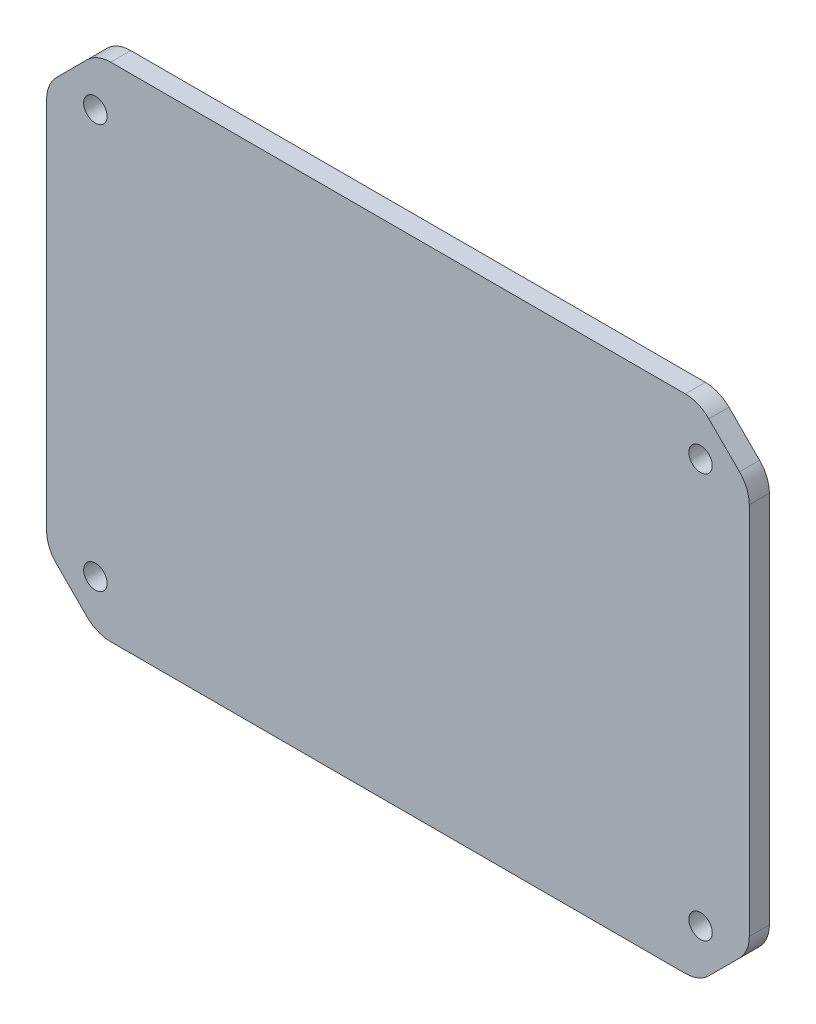
ISO-10303-21;
HEADER;
FILE_DESCRIPTION(('STEP AP214'),'2;1');
FILE_NAME('part.step','',(''),(''),'','','');
FILE_SCHEMA(('AUTOMOTIVE_DESIGN { 1 0 10303 214 1 1 1 1 }'));
ENDSEC;
DATA;
#1=APPLICATION_CONTEXT('core data for automotive mechanical design processes');
#2=APPLICATION_PROTOCOL_DEFINITION('international standard','automotive_design',2000,#1);
#3=PRODUCT_CONTEXT('',#1,'mechanical');
#4=PRODUCT('Part','Part','',(#3));
#5=PRODUCT_RELATED_PRODUCT_CATEGORY('part','',(#4));
#6=PRODUCT_DEFINITION_FORMATION('','',#4);
#7=PRODUCT_DEFINITION_CONTEXT('part definition',#1,'design');
#8=PRODUCT_DEFINITION('design','',#6,#7);
#9=PRODUCT_DEFINITION_SHAPE('','',#8);
#10=(LENGTH_UNIT() NAMED_UNIT(*) SI_UNIT(.MILLI.,.METRE.));
#11=(NAMED_UNIT(*) PLANE_ANGLE_UNIT() SI_UNIT($,.RADIAN.));
#12=(NAMED_UNIT(*) SI_UNIT($,.STERADIAN.) SOLID_ANGLE_UNIT());
#13=UNCERTAINTY_MEASURE_WITH_UNIT(LENGTH_MEASURE(1.E-05),#10,'distance_accuracy_value','');
#14=(GEOMETRIC_REPRESENTATION_CONTEXT(3) GLOBAL_UNCERTAINTY_ASSIGNED_CONTEXT((#13)) GLOBAL_UNIT_ASSIGNED_CONTEXT((#10,
#11,#12)) REPRESENTATION_CONTEXT('',''));
#15=CARTESIAN_POINT('',(0.,0.,0.));
#16=DIRECTION('',(0.,0.,1.));
#17=DIRECTION('',(1.,0.,0.));
#18=AXIS2_PLACEMENT_3D('',#15,#16,#17);
#19=CARTESIAN_POINT('',(-42.9289321881345,-32.5,3.));
#20=DIRECTION('',(0.,0.,1.));
#21=DIRECTION('',(1.,0.,0.));
#22=AXIS2_PLACEMENT_3D('',#19,#20,#21);
#23=PLANE('',#22);
#24=CARTESIAN_POINT('',(45.2144660940672,-30.2144660940673,3.));
#25=DIRECTION('',(0.,0.,1.));
#26=DIRECTION('',(1.,0.,0.));
#27=AXIS2_PLACEMENT_3D('',#24,#25,#26);
#28=CIRCLE('',#27,1.75);
#29=CARTESIAN_POINT('',(46.9644660940672,-30.2144660940673,3.));
#30=VERTEX_POINT('',#29);
#31=EDGE_CURVE('E345',#30,#30,#28,.T.);
#32=ORIENTED_EDGE('',*,*,#31,.F.);
#33=EDGE_LOOP('',(#32));
#34=FACE_BOUND('',#33,.T.);
#35=CARTESIAN_POINT('',(-45.2144660940673,30.2144660940673,3.));
#36=DIRECTION('',(0.,0.,1.));
#37=DIRECTION('',(1.,0.,0.));
#38=AXIS2_PLACEMENT_3D('',#35,#36,#37);
#39=CIRCLE('',#38,1.75);
#40=CARTESIAN_POINT('',(-43.4644660940673,30.2144660940673,3.));
#41=VERTEX_POINT('',#40);
#42=EDGE_CURVE('E184',#41,#41,#39,.T.);
#43=ORIENTED_EDGE('',*,*,#42,.F.);
#44=EDGE_LOOP('',(#43));
#45=FACE_BOUND('',#44,.T.);
#46=CARTESIAN_POINT('',(-42.9289321881345,-32.5,3.));
#47=DIRECTION('',(0.,0.,1.));
#48=DIRECTION('',(1.,0.,0.));
#49=AXIS2_PLACEMENT_3D('',#46,#47,#48);
#50=CIRCLE('',#49,5.);
#51=CARTESIAN_POINT('',(-46.4644660940673,-36.0355339059327,3.));
#52=VERTEX_POINT('',#51);
#53=CARTESIAN_POINT('',(-42.9289321881345,-37.5,3.));
#54=VERTEX_POINT('',#53);
#55=EDGE_CURVE('E211',#52,#54,#50,.T.);
#56=ORIENTED_EDGE('',*,*,#55,.T.);
#57=DIRECTION('',(1.,0.,0.));
#58=VECTOR('',#57,1.);
#59=CARTESIAN_POINT('',(-42.9289321881345,-37.5,3.));
#60=LINE('',#59,#58);
#61=CARTESIAN_POINT('',(42.9289321881345,-37.5,3.));
#62=VERTEX_POINT('',#61);
#63=EDGE_CURVE('E119',#54,#62,#60,.T.);
#64=ORIENTED_EDGE('',*,*,#63,.T.);
#65=CARTESIAN_POINT('',(42.9289321881345,-32.5,3.));
#66=DIRECTION('',(0.,0.,1.));
#67=DIRECTION('',(-1.,0.,0.));
#68=AXIS2_PLACEMENT_3D('',#65,#66,#67);
#69=CIRCLE('',#68,5.);
#70=CARTESIAN_POINT('',(46.4644660940673,-36.0355339059327,3.));
#71=VERTEX_POINT('',#70);
#72=EDGE_CURVE('E250',#62,#71,#69,.T.);
#73=ORIENTED_EDGE('',*,*,#72,.T.);
#74=DIRECTION('',(0.707106781186548,0.707106781186548,0.));
#75=VECTOR('',#74,1.);
#76=CARTESIAN_POINT('',(46.4644660940673,-36.0355339059327,3.));
#77=LINE('',#76,#75);
#78=CARTESIAN_POINT('',(51.0355339059327,-31.4644660940673,3.));
#79=VERTEX_POINT('',#78);
#80=EDGE_CURVE('E269',#71,#79,#77,.T.);
#81=ORIENTED_EDGE('',*,*,#80,.T.);
#82=CARTESIAN_POINT('',(47.5,-27.9289321881345,3.));
#83=DIRECTION('',(0.,0.,1.));
#84=DIRECTION('',(1.,0.,0.));
#85=AXIS2_PLACEMENT_3D('',#82,#83,#84);
#86=CIRCLE('',#85,5.);
#87=CARTESIAN_POINT('',(52.5,-27.9289321881345,3.));
#88=VERTEX_POINT('',#87);
#89=EDGE_CURVE('E266',#79,#88,#86,.T.);
#90=ORIENTED_EDGE('',*,*,#89,.T.);
#91=DIRECTION('',(0.,1.,0.));
#92=VECTOR('',#91,1.);
#93=CARTESIAN_POINT('',(52.5,27.9289321881345,3.));
#94=LINE('',#93,#92);
#95=CARTESIAN_POINT('',(52.5,27.9289321881345,3.));
#96=VERTEX_POINT('',#95);
#97=EDGE_CURVE('E268',#88,#96,#94,.T.);
#98=ORIENTED_EDGE('',*,*,#97,.T.);
#99=CARTESIAN_POINT('',(47.5,27.9289321881345,3.));
#100=DIRECTION('',(0.,0.,1.));
#101=DIRECTION('',(-1.,0.,0.));
#102=AXIS2_PLACEMENT_3D('',#99,#100,#101);
#103=CIRCLE('',#102,5.);
#104=CARTESIAN_POINT('',(51.0355339059327,31.4644660940673,3.));
#105=VERTEX_POINT('',#104);
#106=EDGE_CURVE('E271',#96,#105,#103,.T.);
#107=ORIENTED_EDGE('',*,*,#106,.T.);
#108=DIRECTION('',(-0.707106781186548,0.707106781186548,0.));
#109=VECTOR('',#108,1.);
#110=CARTESIAN_POINT('',(46.4644660940673,36.0355339059327,3.));
#111=LINE('',#110,#109);
#112=CARTESIAN_POINT('',(46.4644660940673,36.0355339059327,3.));
#113=VERTEX_POINT('',#112);
#114=EDGE_CURVE('E277',#105,#113,#111,.T.);
#115=ORIENTED_EDGE('',*,*,#114,.T.);
#116=CARTESIAN_POINT('',(42.9289321881345,32.5,3.));
#117=DIRECTION('',(0.,0.,1.));
#118=DIRECTION('',(1.,0.,0.));
#119=AXIS2_PLACEMENT_3D('',#116,#117,#118);
#120=CIRCLE('',#119,5.);
#121=CARTESIAN_POINT('',(42.9289321881345,37.5,3.));
#122=VERTEX_POINT('',#121);
#123=EDGE_CURVE('E279',#113,#122,#120,.T.);
#124=ORIENTED_EDGE('',*,*,#123,.T.);
#125=DIRECTION('',(-1.,0.,0.));
#126=VECTOR('',#125,1.);
#127=CARTESIAN_POINT('',(-42.9289321881345,37.5,3.));
#128=LINE('',#127,#126);
#129=CARTESIAN_POINT('',(-42.9289321881345,37.5,3.));
#130=VERTEX_POINT('',#129);
#131=EDGE_CURVE('E281',#122,#130,#128,.T.);
#132=ORIENTED_EDGE('',*,*,#131,.T.);
#133=CARTESIAN_POINT('',(-42.9289321881345,32.5,3.));
#134=DIRECTION('',(0.,0.,1.));
#135=DIRECTION('',(-1.,0.,0.));
#136=AXIS2_PLACEMENT_3D('',#133,#134,#135);
#137=CIRCLE('',#136,5.);
#138=CARTESIAN_POINT('',(-46.4644660940673,36.0355339059327,3.));
#139=VERTEX_POINT('',#138);
#140=EDGE_CURVE('E283',#130,#139,#137,.T.);
#141=ORIENTED_EDGE('',*,*,#140,.T.);
#142=DIRECTION('',(-0.707106781186548,-0.707106781186548,0.));
#143=VECTOR('',#142,1.);
#144=CARTESIAN_POINT('',(-51.0355339059327,31.4644660940673,3.));
#145=LINE('',#144,#143);
#146=CARTESIAN_POINT('',(-51.0355339059327,31.4644660940673,3.));
#147=VERTEX_POINT('',#146);
#148=EDGE_CURVE('E285',#139,#147,#145,.T.);
#149=ORIENTED_EDGE('',*,*,#148,.T.);
#150=CARTESIAN_POINT('',(-47.5,27.9289321881345,3.));
#151=DIRECTION('',(0.,0.,1.));
#152=DIRECTION('',(1.,0.,0.));
#153=AXIS2_PLACEMENT_3D('',#150,#151,#152);
#154=CIRCLE('',#153,5.);
#155=CARTESIAN_POINT('',(-52.5,27.9289321881345,3.));
#156=VERTEX_POINT('',#155);
#157=EDGE_CURVE('E162',#147,#156,#154,.T.);
#158=ORIENTED_EDGE('',*,*,#157,.T.);
#159=DIRECTION('',(0.,-1.,0.));
#160=VECTOR('',#159,1.);
#161=CARTESIAN_POINT('',(-52.5,27.9289321881345,3.));
#162=LINE('',#161,#160);
#163=CARTESIAN_POINT('',(-52.5,-27.9289321881345,3.));
#164=VERTEX_POINT('',#163);
#165=EDGE_CURVE('E156',#156,#164,#162,.T.);
#166=ORIENTED_EDGE('',*,*,#165,.T.);
#167=CARTESIAN_POINT('',(-47.5,-27.9289321881345,3.));
#168=DIRECTION('',(0.,0.,1.));
#169=DIRECTION('',(-1.,0.,0.));
#170=AXIS2_PLACEMENT_3D('',#167,#168,#169);
#171=CIRCLE('',#170,5.);
#172=CARTESIAN_POINT('',(-51.0355339059327,-31.4644660940673,3.));
#173=VERTEX_POINT('',#172);
#174=EDGE_CURVE('E160',#164,#173,#171,.T.);
#175=ORIENTED_EDGE('',*,*,#174,.T.);
#176=DIRECTION('',(0.707106781186548,-0.707106781186548,0.));
#177=VECTOR('',#176,1.);
#178=CARTESIAN_POINT('',(-51.0355339059327,-31.4644660940673,3.));
#179=LINE('',#178,#177);
#180=EDGE_CURVE('E52',#173,#52,#179,.T.);
#181=ORIENTED_EDGE('',*,*,#180,.T.);
#182=EDGE_LOOP('',(#56,#64,#73,#81,#90,#98,#107,#115,#124,#132,#141,#149,#158,#166,#175,#181));
#183=FACE_BOUND('',#182,.T.);
#184=CARTESIAN_POINT('',(-45.2144660940673,-30.2144660940673,3.));
#185=DIRECTION('',(0.,0.,1.));
#186=DIRECTION('',(-1.,0.,0.));
#187=AXIS2_PLACEMENT_3D('',#184,#185,#186);
#188=CIRCLE('',#187,1.75);
#189=CARTESIAN_POINT('',(-46.9644660940673,-30.2144660940673,3.));
#190=VERTEX_POINT('',#189);
#191=EDGE_CURVE('E351',#190,#190,#188,.T.);
#192=ORIENTED_EDGE('',*,*,#191,.F.);
#193=EDGE_LOOP('',(#192));
#194=FACE_BOUND('',#193,.T.);
#195=CARTESIAN_POINT('',(45.2144660940672,30.2144660940673,3.));
#196=DIRECTION('',(0.,0.,1.));
#197=DIRECTION('',(-1.,0.,0.));
#198=AXIS2_PLACEMENT_3D('',#195,#196,#197);
#199=CIRCLE('',#198,1.75);
#200=CARTESIAN_POINT('',(43.4644660940672,30.2144660940673,3.));
#201=VERTEX_POINT('',#200);
#202=EDGE_CURVE('E336',#201,#201,#199,.T.);
#203=ORIENTED_EDGE('',*,*,#202,.F.);
#204=EDGE_LOOP('',(#203));
#205=FACE_BOUND('',#204,.T.);
#206=ADVANCED_FACE('F35',(#34,#45,#183,#194,#205),#23,.T.);
#207=CARTESIAN_POINT('',(-42.9289321881345,-32.5,0.));
#208=DIRECTION('',(0.,0.,1.));
#209=DIRECTION('',(1.,0.,0.));
#210=AXIS2_PLACEMENT_3D('',#207,#208,#209);
#211=PLANE('',#210);
#212=CARTESIAN_POINT('',(-42.9289321881345,-32.5,0.));
#213=DIRECTION('',(0.,0.,1.));
#214=DIRECTION('',(1.,0.,0.));
#215=AXIS2_PLACEMENT_3D('',#212,#213,#214);
#216=CIRCLE('',#215,5.);
#217=CARTESIAN_POINT('',(-46.4644660940673,-36.0355339059327,0.));
#218=VERTEX_POINT('',#217);
#219=CARTESIAN_POINT('',(-42.9289321881345,-37.5,0.));
#220=VERTEX_POINT('',#219);
#221=EDGE_CURVE('E180',#218,#220,#216,.T.);
#222=ORIENTED_EDGE('',*,*,#221,.F.);
#223=DIRECTION('',(0.707106781186548,-0.707106781186548,0.));
#224=VECTOR('',#223,1.);
#225=CARTESIAN_POINT('',(-51.0355339059327,-31.4644660940673,0.));
#226=LINE('',#225,#224);
#227=CARTESIAN_POINT('',(-51.0355339059327,-31.4644660940673,0.));
#228=VERTEX_POINT('',#227);
#229=EDGE_CURVE('E111',#228,#218,#226,.T.);
#230=ORIENTED_EDGE('',*,*,#229,.F.);
#231=CARTESIAN_POINT('',(-47.5,-27.9289321881345,0.));
#232=DIRECTION('',(0.,0.,1.));
#233=DIRECTION('',(-1.,0.,0.));
#234=AXIS2_PLACEMENT_3D('',#231,#232,#233);
#235=CIRCLE('',#234,5.);
#236=CARTESIAN_POINT('',(-52.5,-27.9289321881345,0.));
#237=VERTEX_POINT('',#236);
#238=EDGE_CURVE('E105',#237,#228,#235,.T.);
#239=ORIENTED_EDGE('',*,*,#238,.F.);
#240=DIRECTION('',(0.,-1.,0.));
#241=VECTOR('',#240,1.);
#242=CARTESIAN_POINT('',(-52.5,27.9289321881345,0.));
#243=LINE('',#242,#241);
#244=CARTESIAN_POINT('',(-52.5,27.9289321881345,0.));
#245=VERTEX_POINT('',#244);
#246=EDGE_CURVE('E170',#245,#237,#243,.T.);
#247=ORIENTED_EDGE('',*,*,#246,.F.);
#248=CARTESIAN_POINT('',(-47.5,27.9289321881345,0.));
#249=DIRECTION('',(0.,0.,1.));
#250=DIRECTION('',(1.,0.,0.));
#251=AXIS2_PLACEMENT_3D('',#248,#249,#250);
#252=CIRCLE('',#251,5.);
#253=CARTESIAN_POINT('',(-51.0355339059327,31.4644660940673,0.));
#254=VERTEX_POINT('',#253);
#255=EDGE_CURVE('E206',#254,#245,#252,.T.);
#256=ORIENTED_EDGE('',*,*,#255,.F.);
#257=DIRECTION('',(-0.707106781186548,-0.707106781186548,0.));
#258=VECTOR('',#257,1.);
#259=CARTESIAN_POINT('',(-51.0355339059327,31.4644660940673,0.));
#260=LINE('',#259,#258);
#261=CARTESIAN_POINT('',(-46.4644660940673,36.0355339059327,0.));
#262=VERTEX_POINT('',#261);
#263=EDGE_CURVE('E204',#262,#254,#260,.T.);
#264=ORIENTED_EDGE('',*,*,#263,.F.);
#265=CARTESIAN_POINT('',(-42.9289321881345,32.5,0.));
#266=DIRECTION('',(0.,0.,1.));
#267=DIRECTION('',(-1.,0.,0.));
#268=AXIS2_PLACEMENT_3D('',#265,#266,#267);
#269=CIRCLE('',#268,5.);
#270=CARTESIAN_POINT('',(-42.9289321881345,37.5,0.));
#271=VERTEX_POINT('',#270);
#272=EDGE_CURVE('E202',#271,#262,#269,.T.);
#273=ORIENTED_EDGE('',*,*,#272,.F.);
#274=DIRECTION('',(-1.,0.,0.));
#275=VECTOR('',#274,1.);
#276=CARTESIAN_POINT('',(-42.9289321881345,37.5,0.));
#277=LINE('',#276,#275);
#278=CARTESIAN_POINT('',(42.9289321881345,37.5,0.));
#279=VERTEX_POINT('',#278);
#280=EDGE_CURVE('E200',#279,#271,#277,.T.);
#281=ORIENTED_EDGE('',*,*,#280,.F.);
#282=CARTESIAN_POINT('',(42.9289321881345,32.5,0.));
#283=DIRECTION('',(0.,0.,1.));
#284=DIRECTION('',(1.,0.,0.));
#285=AXIS2_PLACEMENT_3D('',#282,#283,#284);
#286=CIRCLE('',#285,5.);
#287=CARTESIAN_POINT('',(46.4644660940673,36.0355339059327,0.));
#288=VERTEX_POINT('',#287);
#289=EDGE_CURVE('E198',#288,#279,#286,.T.);
#290=ORIENTED_EDGE('',*,*,#289,.F.);
#291=DIRECTION('',(-0.707106781186548,0.707106781186548,0.));
#292=VECTOR('',#291,1.);
#293=CARTESIAN_POINT('',(46.4644660940673,36.0355339059327,0.));
#294=LINE('',#293,#292);
#295=CARTESIAN_POINT('',(51.0355339059327,31.4644660940673,0.));
#296=VERTEX_POINT('',#295);
#297=EDGE_CURVE('E196',#296,#288,#294,.T.);
#298=ORIENTED_EDGE('',*,*,#297,.F.);
#299=CARTESIAN_POINT('',(47.5,27.9289321881345,0.));
#300=DIRECTION('',(0.,0.,1.));
#301=DIRECTION('',(-1.,0.,0.));
#302=AXIS2_PLACEMENT_3D('',#299,#300,#301);
#303=CIRCLE('',#302,5.);
#304=CARTESIAN_POINT('',(52.5,27.9289321881345,0.));
#305=VERTEX_POINT('',#304);
#306=EDGE_CURVE('E194',#305,#296,#303,.T.);
#307=ORIENTED_EDGE('',*,*,#306,.F.);
#308=DIRECTION('',(0.,1.,0.));
#309=VECTOR('',#308,1.);
#310=CARTESIAN_POINT('',(52.5,27.9289321881345,0.));
#311=LINE('',#310,#309);
#312=CARTESIAN_POINT('',(52.5,-27.9289321881345,0.));
#313=VERTEX_POINT('',#312);
#314=EDGE_CURVE('E192',#313,#305,#311,.T.);
#315=ORIENTED_EDGE('',*,*,#314,.F.);
#316=CARTESIAN_POINT('',(47.5,-27.9289321881345,0.));
#317=DIRECTION('',(0.,0.,1.));
#318=DIRECTION('',(1.,0.,0.));
#319=AXIS2_PLACEMENT_3D('',#316,#317,#318);
#320=CIRCLE('',#319,5.);
#321=CARTESIAN_POINT('',(51.0355339059327,-31.4644660940673,0.));
#322=VERTEX_POINT('',#321);
#323=EDGE_CURVE('E190',#322,#313,#320,.T.);
#324=ORIENTED_EDGE('',*,*,#323,.F.);
#325=DIRECTION('',(0.707106781186548,0.707106781186548,0.));
#326=VECTOR('',#325,1.);
#327=CARTESIAN_POINT('',(46.4644660940673,-36.0355339059327,0.));
#328=LINE('',#327,#326);
#329=CARTESIAN_POINT('',(46.4644660940673,-36.0355339059327,0.));
#330=VERTEX_POINT('',#329);
#331=EDGE_CURVE('E188',#330,#322,#328,.T.);
#332=ORIENTED_EDGE('',*,*,#331,.F.);
#333=CARTESIAN_POINT('',(42.9289321881345,-32.5,0.));
#334=DIRECTION('',(0.,0.,1.));
#335=DIRECTION('',(-1.,0.,0.));
#336=AXIS2_PLACEMENT_3D('',#333,#334,#335);
#337=CIRCLE('',#336,5.);
#338=CARTESIAN_POINT('',(42.9289321881345,-37.5,0.));
#339=VERTEX_POINT('',#338);
#340=EDGE_CURVE('E186',#339,#330,#337,.T.);
#341=ORIENTED_EDGE('',*,*,#340,.F.);
#342=DIRECTION('',(1.,0.,0.));
#343=VECTOR('',#342,1.);
#344=CARTESIAN_POINT('',(-42.9289321881345,-37.5,0.));
#345=LINE('',#344,#343);
#346=EDGE_CURVE('E183',#220,#339,#345,.T.);
#347=ORIENTED_EDGE('',*,*,#346,.F.);
#348=EDGE_LOOP('',(#222,#230,#239,#247,#256,#264,#273,#281,#290,#298,#307,#315,#324,#332,#341,#347));
#349=FACE_BOUND('',#348,.T.);
#350=CARTESIAN_POINT('',(-45.2144660940673,30.2144660940673,0.));
#351=DIRECTION('',(0.,0.,1.));
#352=DIRECTION('',(1.,0.,0.));
#353=AXIS2_PLACEMENT_3D('',#350,#351,#352);
#354=CIRCLE('',#353,1.75);
#355=CARTESIAN_POINT('',(-43.4644660940673,30.2144660940673,0.));
#356=VERTEX_POINT('',#355);
#357=EDGE_CURVE('E354',#356,#356,#354,.T.);
#358=ORIENTED_EDGE('',*,*,#357,.T.);
#359=EDGE_LOOP('',(#358));
#360=FACE_BOUND('',#359,.T.);
#361=CARTESIAN_POINT('',(-45.2144660940673,-30.2144660940673,0.));
#362=DIRECTION('',(0.,0.,1.));
#363=DIRECTION('',(-1.,0.,0.));
#364=AXIS2_PLACEMENT_3D('',#361,#362,#363);
#365=CIRCLE('',#364,1.75);
#366=CARTESIAN_POINT('',(-46.9644660940673,-30.2144660940673,0.));
#367=VERTEX_POINT('',#366);
#368=EDGE_CURVE('E348',#367,#367,#365,.T.);
#369=ORIENTED_EDGE('',*,*,#368,.T.);
#370=EDGE_LOOP('',(#369));
#371=FACE_BOUND('',#370,.T.);
#372=CARTESIAN_POINT('',(45.2144660940672,-30.2144660940673,0.));
#373=DIRECTION('',(0.,0.,1.));
#374=DIRECTION('',(1.,0.,0.));
#375=AXIS2_PLACEMENT_3D('',#372,#373,#374);
#376=CIRCLE('',#375,1.75);
#377=CARTESIAN_POINT('',(46.9644660940672,-30.2144660940673,0.));
#378=VERTEX_POINT('',#377);
#379=EDGE_CURVE('E342',#378,#378,#376,.T.);
#380=ORIENTED_EDGE('',*,*,#379,.T.);
#381=EDGE_LOOP('',(#380));
#382=FACE_BOUND('',#381,.T.);
#383=CARTESIAN_POINT('',(45.2144660940672,30.2144660940673,0.));
#384=DIRECTION('',(0.,0.,1.));
#385=DIRECTION('',(-1.,0.,0.));
#386=AXIS2_PLACEMENT_3D('',#383,#384,#385);
#387=CIRCLE('',#386,1.75);
#388=CARTESIAN_POINT('',(43.4644660940672,30.2144660940673,0.));
#389=VERTEX_POINT('',#388);
#390=EDGE_CURVE('E339',#389,#389,#387,.T.);
#391=ORIENTED_EDGE('',*,*,#390,.T.);
#392=EDGE_LOOP('',(#391));
#393=FACE_BOUND('',#392,.T.);
#394=ADVANCED_FACE('F254',(#349,#360,#371,#382,#393),#211,.F.);
#395=CARTESIAN_POINT('',(-42.9289321881345,-32.5,3.));
#396=DIRECTION('',(0.,0.,-1.));
#397=DIRECTION('',(-1.,0.,0.));
#398=AXIS2_PLACEMENT_3D('',#395,#396,#397);
#399=CYLINDRICAL_SURFACE('',#398,5.);
#400=ORIENTED_EDGE('',*,*,#221,.T.);
#401=DIRECTION('',(0.,0.,-1.));
#402=VECTOR('',#401,1.);
#403=CARTESIAN_POINT('',(-42.9289321881345,-37.5,3.));
#404=LINE('',#403,#402);
#405=EDGE_CURVE('E11',#54,#220,#404,.T.);
#406=ORIENTED_EDGE('',*,*,#405,.F.);
#407=ORIENTED_EDGE('',*,*,#55,.F.);
#408=DIRECTION('',(0.,0.,-1.));
#409=VECTOR('',#408,1.);
#410=CARTESIAN_POINT('',(-46.4644660940673,-36.0355339059327,3.));
#411=LINE('',#410,#409);
#412=EDGE_CURVE('E176',#52,#218,#411,.T.);
#413=ORIENTED_EDGE('',*,*,#412,.T.);
#414=EDGE_LOOP('',(#400,#406,#407,#413));
#415=FACE_BOUND('',#414,.T.);
#416=ADVANCED_FACE('F37',(#415),#399,.T.);
#417=CARTESIAN_POINT('',(-42.9289321881345,-37.5,3.));
#418=DIRECTION('',(0.,1.,0.));
#419=DIRECTION('',(0.,0.,1.));
#420=AXIS2_PLACEMENT_3D('',#417,#418,#419);
#421=PLANE('',#420);
#422=ORIENTED_EDGE('',*,*,#346,.T.);
#423=DIRECTION('',(0.,0.,-1.));
#424=VECTOR('',#423,1.);
#425=CARTESIAN_POINT('',(42.9289321881345,-37.5,3.));
#426=LINE('',#425,#424);
#427=EDGE_CURVE('E44',#62,#339,#426,.T.);
#428=ORIENTED_EDGE('',*,*,#427,.F.);
#429=ORIENTED_EDGE('',*,*,#63,.F.);
#430=ORIENTED_EDGE('',*,*,#405,.T.);
#431=EDGE_LOOP('',(#422,#428,#429,#430));
#432=FACE_BOUND('',#431,.T.);
#433=ADVANCED_FACE('F504',(#432),#421,.F.);
#434=CARTESIAN_POINT('',(42.9289321881345,-32.5,3.));
#435=DIRECTION('',(0.,0.,-1.));
#436=DIRECTION('',(-1.,0.,0.));
#437=AXIS2_PLACEMENT_3D('',#434,#435,#436);
#438=CYLINDRICAL_SURFACE('',#437,5.);
#439=ORIENTED_EDGE('',*,*,#340,.T.);
#440=DIRECTION('',(0.,0.,-1.));
#441=VECTOR('',#440,1.);
#442=CARTESIAN_POINT('',(46.4644660940673,-36.0355339059327,3.));
#443=LINE('',#442,#441);
#444=EDGE_CURVE('E242',#71,#330,#443,.T.);
#445=ORIENTED_EDGE('',*,*,#444,.F.);
#446=ORIENTED_EDGE('',*,*,#72,.F.);
#447=ORIENTED_EDGE('',*,*,#427,.T.);
#448=EDGE_LOOP('',(#439,#445,#446,#447));
#449=FACE_BOUND('',#448,.T.);
#450=ADVANCED_FACE('F248',(#449),#438,.T.);
#451=CARTESIAN_POINT('',(46.4644660940673,-36.0355339059327,3.));
#452=DIRECTION('',(-0.707106781186548,0.707106781186548,0.));
#453=DIRECTION('',(-0.707106781186548,-0.707106781186548,0.));
#454=AXIS2_PLACEMENT_3D('',#451,#452,#453);
#455=PLANE('',#454);
#456=ORIENTED_EDGE('',*,*,#331,.T.);
#457=DIRECTION('',(0.,0.,-1.));
#458=VECTOR('',#457,1.);
#459=CARTESIAN_POINT('',(51.0355339059327,-31.4644660940673,3.));
#460=LINE('',#459,#458);
#461=EDGE_CURVE('E239',#79,#322,#460,.T.);
#462=ORIENTED_EDGE('',*,*,#461,.F.);
#463=ORIENTED_EDGE('',*,*,#80,.F.);
#464=ORIENTED_EDGE('',*,*,#444,.T.);
#465=EDGE_LOOP('',(#456,#462,#463,#464));
#466=FACE_BOUND('',#465,.T.);
#467=ADVANCED_FACE('F260',(#466),#455,.F.);
#468=CARTESIAN_POINT('',(47.5,-27.9289321881345,3.));
#469=DIRECTION('',(0.,0.,-1.));
#470=DIRECTION('',(-1.,0.,0.));
#471=AXIS2_PLACEMENT_3D('',#468,#469,#470);
#472=CYLINDRICAL_SURFACE('',#471,5.);
#473=ORIENTED_EDGE('',*,*,#323,.T.);
#474=DIRECTION('',(0.,0.,-1.));
#475=VECTOR('',#474,1.);
#476=CARTESIAN_POINT('',(52.5,-27.9289321881345,3.));
#477=LINE('',#476,#475);
#478=EDGE_CURVE('E236',#88,#313,#477,.T.);
#479=ORIENTED_EDGE('',*,*,#478,.F.);
#480=ORIENTED_EDGE('',*,*,#89,.F.);
#481=ORIENTED_EDGE('',*,*,#461,.T.);
#482=EDGE_LOOP('',(#473,#479,#480,#481));
#483=FACE_BOUND('',#482,.T.);
#484=ADVANCED_FACE('F264',(#483),#472,.T.);
#485=CARTESIAN_POINT('',(52.5,27.9289321881345,3.));
#486=DIRECTION('',(-1.,0.,0.));
#487=DIRECTION('',(0.,-1.,0.));
#488=AXIS2_PLACEMENT_3D('',#485,#486,#487);
#489=PLANE('',#488);
#490=ORIENTED_EDGE('',*,*,#314,.T.);
#491=DIRECTION('',(0.,0.,-1.));
#492=VECTOR('',#491,1.);
#493=CARTESIAN_POINT('',(52.5,27.9289321881345,3.));
#494=LINE('',#493,#492);
#495=EDGE_CURVE('E233',#96,#305,#494,.T.);
#496=ORIENTED_EDGE('',*,*,#495,.F.);
#497=ORIENTED_EDGE('',*,*,#97,.F.);
#498=ORIENTED_EDGE('',*,*,#478,.T.);
#499=EDGE_LOOP('',(#490,#496,#497,#498));
#500=FACE_BOUND('',#499,.T.);
#501=ADVANCED_FACE('F469',(#500),#489,.F.);
#502=CARTESIAN_POINT('',(47.5,27.9289321881345,3.));
#503=DIRECTION('',(0.,0.,-1.));
#504=DIRECTION('',(-1.,0.,0.));
#505=AXIS2_PLACEMENT_3D('',#502,#503,#504);
#506=CYLINDRICAL_SURFACE('',#505,5.);
#507=ORIENTED_EDGE('',*,*,#306,.T.);
#508=DIRECTION('',(0.,0.,-1.));
#509=VECTOR('',#508,1.);
#510=CARTESIAN_POINT('',(51.0355339059327,31.4644660940673,3.));
#511=LINE('',#510,#509);
#512=EDGE_CURVE('E230',#105,#296,#511,.T.);
#513=ORIENTED_EDGE('',*,*,#512,.F.);
#514=ORIENTED_EDGE('',*,*,#106,.F.);
#515=ORIENTED_EDGE('',*,*,#495,.T.);
#516=EDGE_LOOP('',(#507,#513,#514,#515));
#517=FACE_BOUND('',#516,.T.);
#518=ADVANCED_FACE('F459',(#517),#506,.T.);
#519=CARTESIAN_POINT('',(46.4644660940673,36.0355339059327,3.));
#520=DIRECTION('',(-0.707106781186548,-0.707106781186548,0.));
#521=DIRECTION('',(0.707106781186548,-0.707106781186548,0.));
#522=AXIS2_PLACEMENT_3D('',#519,#520,#521);
#523=PLANE('',#522);
#524=ORIENTED_EDGE('',*,*,#297,.T.);
#525=DIRECTION('',(0.,0.,-1.));
#526=VECTOR('',#525,1.);
#527=CARTESIAN_POINT('',(46.4644660940673,36.0355339059327,3.));
#528=LINE('',#527,#526);
#529=EDGE_CURVE('E227',#113,#288,#528,.T.);
#530=ORIENTED_EDGE('',*,*,#529,.F.);
#531=ORIENTED_EDGE('',*,*,#114,.F.);
#532=ORIENTED_EDGE('',*,*,#512,.T.);
#533=EDGE_LOOP('',(#524,#530,#531,#532));
#534=FACE_BOUND('',#533,.T.);
#535=ADVANCED_FACE('F449',(#534),#523,.F.);
#536=CARTESIAN_POINT('',(42.9289321881345,32.5,3.));
#537=DIRECTION('',(0.,0.,-1.));
#538=DIRECTION('',(-1.,0.,0.));
#539=AXIS2_PLACEMENT_3D('',#536,#537,#538);
#540=CYLINDRICAL_SURFACE('',#539,5.);
#541=ORIENTED_EDGE('',*,*,#289,.T.);
#542=DIRECTION('',(0.,0.,-1.));
#543=VECTOR('',#542,1.);
#544=CARTESIAN_POINT('',(42.9289321881345,37.5,3.));
#545=LINE('',#544,#543);
#546=EDGE_CURVE('E224',#122,#279,#545,.T.);
#547=ORIENTED_EDGE('',*,*,#546,.F.);
#548=ORIENTED_EDGE('',*,*,#123,.F.);
#549=ORIENTED_EDGE('',*,*,#529,.T.);
#550=EDGE_LOOP('',(#541,#547,#548,#549));
#551=FACE_BOUND('',#550,.T.);
#552=ADVANCED_FACE('F439',(#551),#540,.T.);
#553=CARTESIAN_POINT('',(-42.9289321881345,37.5,3.));
#554=DIRECTION('',(0.,-1.,0.));
#555=DIRECTION('',(0.,0.,-1.));
#556=AXIS2_PLACEMENT_3D('',#553,#554,#555);
#557=PLANE('',#556);
#558=ORIENTED_EDGE('',*,*,#280,.T.);
#559=DIRECTION('',(0.,0.,-1.));
#560=VECTOR('',#559,1.);
#561=CARTESIAN_POINT('',(-42.9289321881345,37.5,3.));
#562=LINE('',#561,#560);
#563=EDGE_CURVE('E221',#130,#271,#562,.T.);
#564=ORIENTED_EDGE('',*,*,#563,.F.);
#565=ORIENTED_EDGE('',*,*,#131,.F.);
#566=ORIENTED_EDGE('',*,*,#546,.T.);
#567=EDGE_LOOP('',(#558,#564,#565,#566));
#568=FACE_BOUND('',#567,.T.);
#569=ADVANCED_FACE('F429',(#568),#557,.F.);
#570=CARTESIAN_POINT('',(-42.9289321881345,32.5,3.));
#571=DIRECTION('',(0.,0.,-1.));
#572=DIRECTION('',(-1.,0.,0.));
#573=AXIS2_PLACEMENT_3D('',#570,#571,#572);
#574=CYLINDRICAL_SURFACE('',#573,5.);
#575=ORIENTED_EDGE('',*,*,#272,.T.);
#576=DIRECTION('',(0.,0.,-1.));
#577=VECTOR('',#576,1.);
#578=CARTESIAN_POINT('',(-46.4644660940673,36.0355339059327,3.));
#579=LINE('',#578,#577);
#580=EDGE_CURVE('E218',#139,#262,#579,.T.);
#581=ORIENTED_EDGE('',*,*,#580,.F.);
#582=ORIENTED_EDGE('',*,*,#140,.F.);
#583=ORIENTED_EDGE('',*,*,#563,.T.);
#584=EDGE_LOOP('',(#575,#581,#582,#583));
#585=FACE_BOUND('',#584,.T.);
#586=ADVANCED_FACE('F420',(#585),#574,.T.);
#587=CARTESIAN_POINT('',(-51.0355339059327,31.4644660940673,3.));
#588=DIRECTION('',(0.707106781186548,-0.707106781186548,0.));
#589=DIRECTION('',(0.707106781186548,0.707106781186548,0.));
#590=AXIS2_PLACEMENT_3D('',#587,#588,#589);
#591=PLANE('',#590);
#592=ORIENTED_EDGE('',*,*,#263,.T.);
#593=DIRECTION('',(0.,0.,-1.));
#594=VECTOR('',#593,1.);
#595=CARTESIAN_POINT('',(-51.0355339059327,31.4644660940673,3.));
#596=LINE('',#595,#594);
#597=EDGE_CURVE('E215',#147,#254,#596,.T.);
#598=ORIENTED_EDGE('',*,*,#597,.F.);
#599=ORIENTED_EDGE('',*,*,#148,.F.);
#600=ORIENTED_EDGE('',*,*,#580,.T.);
#601=EDGE_LOOP('',(#592,#598,#599,#600));
#602=FACE_BOUND('',#601,.T.);
#603=ADVANCED_FACE('F291',(#602),#591,.F.);
#604=CARTESIAN_POINT('',(-47.5,27.9289321881345,3.));
#605=DIRECTION('',(0.,0.,-1.));
#606=DIRECTION('',(-1.,0.,0.));
#607=AXIS2_PLACEMENT_3D('',#604,#605,#606);
#608=CYLINDRICAL_SURFACE('',#607,5.);
#609=ORIENTED_EDGE('',*,*,#255,.T.);
#610=DIRECTION('',(0.,0.,-1.));
#611=VECTOR('',#610,1.);
#612=CARTESIAN_POINT('',(-52.5,27.9289321881345,3.));
#613=LINE('',#612,#611);
#614=EDGE_CURVE('E171',#156,#245,#613,.T.);
#615=ORIENTED_EDGE('',*,*,#614,.F.);
#616=ORIENTED_EDGE('',*,*,#157,.F.);
#617=ORIENTED_EDGE('',*,*,#597,.T.);
#618=EDGE_LOOP('',(#609,#615,#616,#617));
#619=FACE_BOUND('',#618,.T.);
#620=ADVANCED_FACE('F295',(#619),#608,.T.);
#621=CARTESIAN_POINT('',(-52.5,27.9289321881345,3.));
#622=DIRECTION('',(1.,0.,0.));
#623=DIRECTION('',(0.,1.,0.));
#624=AXIS2_PLACEMENT_3D('',#621,#622,#623);
#625=PLANE('',#624);
#626=ORIENTED_EDGE('',*,*,#246,.T.);
#627=DIRECTION('',(0.,0.,-1.));
#628=VECTOR('',#627,1.);
#629=CARTESIAN_POINT('',(-52.5,-27.9289321881345,3.));
#630=LINE('',#629,#628);
#631=EDGE_CURVE('E167',#164,#237,#630,.T.);
#632=ORIENTED_EDGE('',*,*,#631,.F.);
#633=ORIENTED_EDGE('',*,*,#165,.F.);
#634=ORIENTED_EDGE('',*,*,#614,.T.);
#635=EDGE_LOOP('',(#626,#632,#633,#634));
#636=FACE_BOUND('',#635,.T.);
#637=ADVANCED_FACE('F168',(#636),#625,.F.);
#638=CARTESIAN_POINT('',(-47.5,-27.9289321881345,3.));
#639=DIRECTION('',(0.,0.,-1.));
#640=DIRECTION('',(-1.,0.,0.));
#641=AXIS2_PLACEMENT_3D('',#638,#639,#640);
#642=CYLINDRICAL_SURFACE('',#641,5.);
#643=ORIENTED_EDGE('',*,*,#238,.T.);
#644=DIRECTION('',(0.,0.,-1.));
#645=VECTOR('',#644,1.);
#646=CARTESIAN_POINT('',(-51.0355339059327,-31.4644660940673,3.));
#647=LINE('',#646,#645);
#648=EDGE_CURVE('E172',#173,#228,#647,.T.);
#649=ORIENTED_EDGE('',*,*,#648,.F.);
#650=ORIENTED_EDGE('',*,*,#174,.F.);
#651=ORIENTED_EDGE('',*,*,#631,.T.);
#652=EDGE_LOOP('',(#643,#649,#650,#651));
#653=FACE_BOUND('',#652,.T.);
#654=ADVANCED_FACE('F174',(#653),#642,.T.);
#655=CARTESIAN_POINT('',(-51.0355339059327,-31.4644660940673,3.));
#656=DIRECTION('',(0.707106781186548,0.707106781186548,0.));
#657=DIRECTION('',(-0.707106781186548,0.707106781186548,0.));
#658=AXIS2_PLACEMENT_3D('',#655,#656,#657);
#659=PLANE('',#658);
#660=ORIENTED_EDGE('',*,*,#229,.T.);
#661=ORIENTED_EDGE('',*,*,#412,.F.);
#662=ORIENTED_EDGE('',*,*,#180,.F.);
#663=ORIENTED_EDGE('',*,*,#648,.T.);
#664=EDGE_LOOP('',(#660,#661,#662,#663));
#665=FACE_BOUND('',#664,.T.);
#666=ADVANCED_FACE('F299',(#665),#659,.F.);
#667=CARTESIAN_POINT('',(-45.2144660940673,30.2144660940673,3.));
#668=DIRECTION('',(0.,0.,-1.));
#669=DIRECTION('',(-1.,0.,0.));
#670=AXIS2_PLACEMENT_3D('',#667,#668,#669);
#671=CYLINDRICAL_SURFACE('',#670,1.75);
#672=ORIENTED_EDGE('',*,*,#42,.T.);
#673=EDGE_LOOP('',(#672));
#674=FACE_BOUND('',#673,.T.);
#675=ORIENTED_EDGE('',*,*,#357,.F.);
#676=EDGE_LOOP('',(#675));
#677=FACE_BOUND('',#676,.T.);
#678=ADVANCED_FACE('F301',(#674,#677),#671,.F.);
#679=CARTESIAN_POINT('',(-45.2144660940673,-30.2144660940673,3.));
#680=DIRECTION('',(0.,0.,-1.));
#681=DIRECTION('',(-1.,0.,0.));
#682=AXIS2_PLACEMENT_3D('',#679,#680,#681);
#683=CYLINDRICAL_SURFACE('',#682,1.75);
#684=ORIENTED_EDGE('',*,*,#191,.T.);
#685=EDGE_LOOP('',(#684));
#686=FACE_BOUND('',#685,.T.);
#687=ORIENTED_EDGE('',*,*,#368,.F.);
#688=EDGE_LOOP('',(#687));
#689=FACE_BOUND('',#688,.T.);
#690=ADVANCED_FACE('F307',(#686,#689),#683,.F.);
#691=CARTESIAN_POINT('',(45.2144660940672,-30.2144660940673,3.));
#692=DIRECTION('',(0.,0.,-1.));
#693=DIRECTION('',(-1.,0.,0.));
#694=AXIS2_PLACEMENT_3D('',#691,#692,#693);
#695=CYLINDRICAL_SURFACE('',#694,1.75);
#696=ORIENTED_EDGE('',*,*,#31,.T.);
#697=EDGE_LOOP('',(#696));
#698=FACE_BOUND('',#697,.T.);
#699=ORIENTED_EDGE('',*,*,#379,.F.);
#700=EDGE_LOOP('',(#699));
#701=FACE_BOUND('',#700,.T.);
#702=ADVANCED_FACE('F323',(#698,#701),#695,.F.);
#703=CARTESIAN_POINT('',(45.2144660940672,30.2144660940673,3.));
#704=DIRECTION('',(0.,0.,-1.));
#705=DIRECTION('',(-1.,0.,0.));
#706=AXIS2_PLACEMENT_3D('',#703,#704,#705);
#707=CYLINDRICAL_SURFACE('',#706,1.75);
#708=ORIENTED_EDGE('',*,*,#202,.T.);
#709=EDGE_LOOP('',(#708));
#710=FACE_BOUND('',#709,.T.);
#711=ORIENTED_EDGE('',*,*,#390,.F.);
#712=EDGE_LOOP('',(#711));
#713=FACE_BOUND('',#712,.T.);
#714=ADVANCED_FACE('F327',(#710,#713),#707,.F.);
#715=CLOSED_SHELL('',(#206,#394,#416,#433,#450,#467,#484,#501,#518,#535,#552,#569,#586,#603,
#620,#637,#654,#666,#678,#690,#702,#714));
#716=MANIFOLD_SOLID_BREP('B2',#715);
#717=ADVANCED_BREP_SHAPE_REPRESENTATION('',(#18,#716),#14);
#718=SHAPE_DEFINITION_REPRESENTATION(#9,#717);
ENDSEC;
END-ISO-10303-21;
